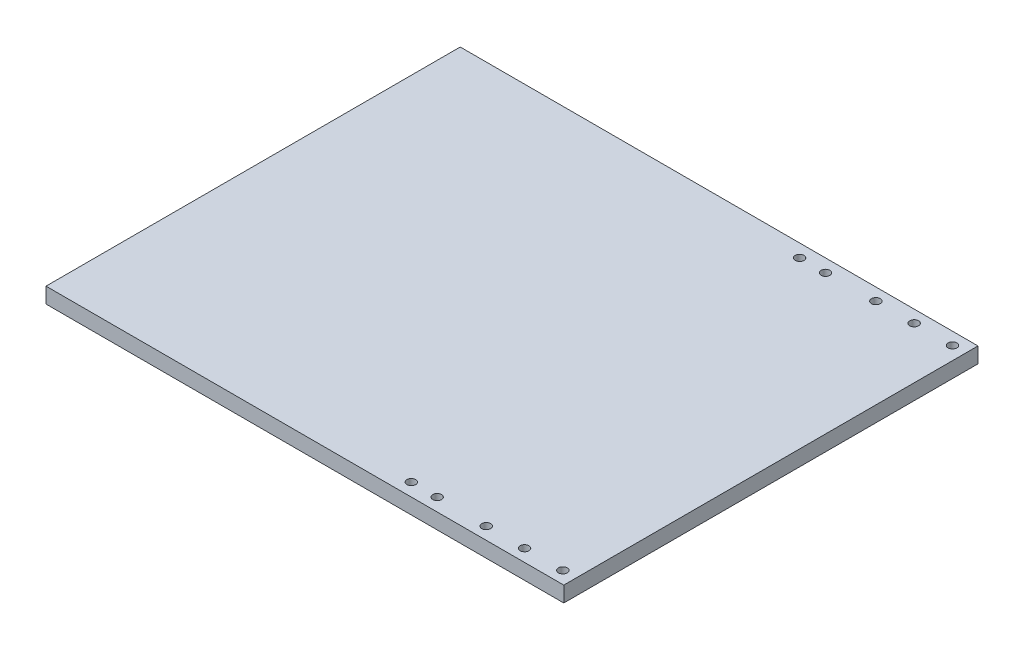
ISO-10303-21;
HEADER;
FILE_DESCRIPTION(('STEP AP214'),'2;1');
FILE_NAME('part.step','',(''),(''),'','','');
FILE_SCHEMA(('AUTOMOTIVE_DESIGN { 1 0 10303 214 1 1 1 1 }'));
ENDSEC;
DATA;
#1=APPLICATION_CONTEXT('core data for automotive mechanical design processes');
#2=APPLICATION_PROTOCOL_DEFINITION('international standard','automotive_design',2000,#1);
#3=PRODUCT_CONTEXT('',#1,'mechanical');
#4=PRODUCT('Part','Part','',(#3));
#5=PRODUCT_RELATED_PRODUCT_CATEGORY('part','',(#4));
#6=PRODUCT_DEFINITION_FORMATION('','',#4);
#7=PRODUCT_DEFINITION_CONTEXT('part definition',#1,'design');
#8=PRODUCT_DEFINITION('design','',#6,#7);
#9=PRODUCT_DEFINITION_SHAPE('','',#8);
#10=(LENGTH_UNIT() NAMED_UNIT(*) SI_UNIT(.MILLI.,.METRE.));
#11=(NAMED_UNIT(*) PLANE_ANGLE_UNIT() SI_UNIT($,.RADIAN.));
#12=(NAMED_UNIT(*) SI_UNIT($,.STERADIAN.) SOLID_ANGLE_UNIT());
#13=UNCERTAINTY_MEASURE_WITH_UNIT(LENGTH_MEASURE(1.E-05),#10,'distance_accuracy_value','');
#14=(GEOMETRIC_REPRESENTATION_CONTEXT(3) GLOBAL_UNCERTAINTY_ASSIGNED_CONTEXT((#13)) GLOBAL_UNIT_ASSIGNED_CONTEXT((#10,
#11,#12)) REPRESENTATION_CONTEXT('',''));
#15=CARTESIAN_POINT('',(0.,0.,0.));
#16=DIRECTION('',(0.,0.,1.));
#17=DIRECTION('',(1.,0.,0.));
#18=AXIS2_PLACEMENT_3D('',#15,#16,#17);
#19=CARTESIAN_POINT('',(100.,6.,80.));
#20=DIRECTION('',(-1.,0.,0.));
#21=DIRECTION('',(0.,0.,1.));
#22=AXIS2_PLACEMENT_3D('',#19,#20,#21);
#23=PLANE('',#22);
#24=DIRECTION('',(0.,0.,-1.));
#25=VECTOR('',#24,1.);
#26=CARTESIAN_POINT('',(100.,0.,80.));
#27=LINE('',#26,#25);
#28=CARTESIAN_POINT('',(100.,0.,80.));
#29=VERTEX_POINT('',#28);
#30=CARTESIAN_POINT('',(100.,0.,-80.));
#31=VERTEX_POINT('',#30);
#32=EDGE_CURVE('E96',#29,#31,#27,.T.);
#33=ORIENTED_EDGE('',*,*,#32,.T.);
#34=DIRECTION('',(0.,-1.,0.));
#35=VECTOR('',#34,1.);
#36=CARTESIAN_POINT('',(100.,6.,-80.));
#37=LINE('',#36,#35);
#38=CARTESIAN_POINT('',(100.,6.,-80.));
#39=VERTEX_POINT('',#38);
#40=EDGE_CURVE('E11',#39,#31,#37,.T.);
#41=ORIENTED_EDGE('',*,*,#40,.F.);
#42=DIRECTION('',(0.,0.,-1.));
#43=VECTOR('',#42,1.);
#44=CARTESIAN_POINT('',(100.,6.,80.));
#45=LINE('',#44,#43);
#46=CARTESIAN_POINT('',(100.,6.,80.));
#47=VERTEX_POINT('',#46);
#48=EDGE_CURVE('E84',#47,#39,#45,.T.);
#49=ORIENTED_EDGE('',*,*,#48,.F.);
#50=DIRECTION('',(0.,-1.,0.));
#51=VECTOR('',#50,1.);
#52=CARTESIAN_POINT('',(100.,6.,80.));
#53=LINE('',#52,#51);
#54=EDGE_CURVE('E92',#47,#29,#53,.T.);
#55=ORIENTED_EDGE('',*,*,#54,.T.);
#56=EDGE_LOOP('',(#33,#41,#49,#55));
#57=FACE_BOUND('',#56,.T.);
#58=ADVANCED_FACE('F33',(#57),#23,.F.);
#59=CARTESIAN_POINT('',(-100.,6.,-80.));
#60=DIRECTION('',(0.,0.,1.));
#61=DIRECTION('',(1.,0.,0.));
#62=AXIS2_PLACEMENT_3D('',#59,#60,#61);
#63=PLANE('',#62);
#64=DIRECTION('',(-1.,0.,0.));
#65=VECTOR('',#64,1.);
#66=CARTESIAN_POINT('',(-100.,0.,-80.));
#67=LINE('',#66,#65);
#68=CARTESIAN_POINT('',(-100.,0.,-80.));
#69=VERTEX_POINT('',#68);
#70=EDGE_CURVE('E88',#31,#69,#67,.T.);
#71=ORIENTED_EDGE('',*,*,#70,.T.);
#72=DIRECTION('',(0.,-1.,0.));
#73=VECTOR('',#72,1.);
#74=CARTESIAN_POINT('',(-100.,6.,-80.));
#75=LINE('',#74,#73);
#76=CARTESIAN_POINT('',(-100.,6.,-80.));
#77=VERTEX_POINT('',#76);
#78=EDGE_CURVE('E41',#77,#69,#75,.T.);
#79=ORIENTED_EDGE('',*,*,#78,.F.);
#80=DIRECTION('',(-1.,0.,0.));
#81=VECTOR('',#80,1.);
#82=CARTESIAN_POINT('',(-100.,6.,-80.));
#83=LINE('',#82,#81);
#84=EDGE_CURVE('E79',#39,#77,#83,.T.);
#85=ORIENTED_EDGE('',*,*,#84,.F.);
#86=ORIENTED_EDGE('',*,*,#40,.T.);
#87=EDGE_LOOP('',(#71,#79,#85,#86));
#88=FACE_BOUND('',#87,.T.);
#89=ADVANCED_FACE('F87',(#88),#63,.F.);
#90=CARTESIAN_POINT('',(-100.,6.,80.));
#91=DIRECTION('',(1.,0.,0.));
#92=DIRECTION('',(0.,0.,-1.));
#93=AXIS2_PLACEMENT_3D('',#90,#91,#92);
#94=PLANE('',#93);
#95=DIRECTION('',(0.,0.,1.));
#96=VECTOR('',#95,1.);
#97=CARTESIAN_POINT('',(-100.,0.,80.));
#98=LINE('',#97,#96);
#99=CARTESIAN_POINT('',(-100.,0.,80.));
#100=VERTEX_POINT('',#99);
#101=EDGE_CURVE('E66',#69,#100,#98,.T.);
#102=ORIENTED_EDGE('',*,*,#101,.T.);
#103=DIRECTION('',(0.,-1.,0.));
#104=VECTOR('',#103,1.);
#105=CARTESIAN_POINT('',(-100.,6.,80.));
#106=LINE('',#105,#104);
#107=CARTESIAN_POINT('',(-100.,6.,80.));
#108=VERTEX_POINT('',#107);
#109=EDGE_CURVE('E89',#108,#100,#106,.T.);
#110=ORIENTED_EDGE('',*,*,#109,.F.);
#111=DIRECTION('',(0.,0.,1.));
#112=VECTOR('',#111,1.);
#113=CARTESIAN_POINT('',(-100.,6.,80.));
#114=LINE('',#113,#112);
#115=EDGE_CURVE('E82',#77,#108,#114,.T.);
#116=ORIENTED_EDGE('',*,*,#115,.F.);
#117=ORIENTED_EDGE('',*,*,#78,.T.);
#118=EDGE_LOOP('',(#102,#110,#116,#117));
#119=FACE_BOUND('',#118,.T.);
#120=ADVANCED_FACE('F90',(#119),#94,.F.);
#121=CARTESIAN_POINT('',(-100.,6.,80.));
#122=DIRECTION('',(0.,0.,-1.));
#123=DIRECTION('',(-1.,0.,0.));
#124=AXIS2_PLACEMENT_3D('',#121,#122,#123);
#125=PLANE('',#124);
#126=DIRECTION('',(1.,0.,0.));
#127=VECTOR('',#126,1.);
#128=CARTESIAN_POINT('',(-100.,0.,80.));
#129=LINE('',#128,#127);
#130=EDGE_CURVE('E72',#100,#29,#129,.T.);
#131=ORIENTED_EDGE('',*,*,#130,.T.);
#132=ORIENTED_EDGE('',*,*,#54,.F.);
#133=DIRECTION('',(1.,0.,0.));
#134=VECTOR('',#133,1.);
#135=CARTESIAN_POINT('',(-100.,6.,80.));
#136=LINE('',#135,#134);
#137=EDGE_CURVE('E49',#108,#47,#136,.T.);
#138=ORIENTED_EDGE('',*,*,#137,.F.);
#139=ORIENTED_EDGE('',*,*,#109,.T.);
#140=EDGE_LOOP('',(#131,#132,#138,#139));
#141=FACE_BOUND('',#140,.T.);
#142=ADVANCED_FACE('F104',(#141),#125,.F.);
#143=CARTESIAN_POINT('',(0.,6.,0.));
#144=DIRECTION('',(0.,-1.,0.));
#145=DIRECTION('',(0.,0.,-1.));
#146=AXIS2_PLACEMENT_3D('',#143,#144,#145);
#147=PLANE('',#146);
#148=CARTESIAN_POINT('',(94.9,6.,75.2499999999993));
#149=DIRECTION('',(0.,1.,0.));
#150=DIRECTION('',(0.,0.,1.));
#151=AXIS2_PLACEMENT_3D('',#148,#149,#150);
#152=CIRCLE('',#151,1.69999999999999);
#153=CARTESIAN_POINT('',(94.9,6.,76.9499999999993));
#154=VERTEX_POINT('',#153);
#155=EDGE_CURVE('E166',#154,#154,#152,.T.);
#156=ORIENTED_EDGE('',*,*,#155,.F.);
#157=EDGE_LOOP('',(#156));
#158=FACE_BOUND('',#157,.T.);
#159=CARTESIAN_POINT('',(80.1,6.,75.2499999999993));
#160=DIRECTION('',(0.,1.,0.));
#161=DIRECTION('',(0.,0.,1.));
#162=AXIS2_PLACEMENT_3D('',#159,#160,#161);
#163=CIRCLE('',#162,1.69999999999999);
#164=CARTESIAN_POINT('',(80.1,6.,76.9499999999993));
#165=VERTEX_POINT('',#164);
#166=EDGE_CURVE('E160',#165,#165,#163,.T.);
#167=ORIENTED_EDGE('',*,*,#166,.F.);
#168=EDGE_LOOP('',(#167));
#169=FACE_BOUND('',#168,.T.);
#170=CARTESIAN_POINT('',(65.3,6.,75.2499999999993));
#171=DIRECTION('',(0.,1.,0.));
#172=DIRECTION('',(0.,0.,1.));
#173=AXIS2_PLACEMENT_3D('',#170,#171,#172);
#174=CIRCLE('',#173,1.69999999999999);
#175=CARTESIAN_POINT('',(65.3,6.,76.9499999999993));
#176=VERTEX_POINT('',#175);
#177=EDGE_CURVE('E154',#176,#176,#174,.T.);
#178=ORIENTED_EDGE('',*,*,#177,.F.);
#179=EDGE_LOOP('',(#178));
#180=FACE_BOUND('',#179,.T.);
#181=CARTESIAN_POINT('',(94.9000000000004,6.,-75.25));
#182=DIRECTION('',(0.,1.,0.));
#183=DIRECTION('',(0.,0.,1.));
#184=AXIS2_PLACEMENT_3D('',#181,#182,#183);
#185=CIRCLE('',#184,1.69999999999999);
#186=CARTESIAN_POINT('',(94.9000000000004,6.,-73.55));
#187=VERTEX_POINT('',#186);
#188=EDGE_CURVE('E148',#187,#187,#185,.T.);
#189=ORIENTED_EDGE('',*,*,#188,.F.);
#190=EDGE_LOOP('',(#189));
#191=FACE_BOUND('',#190,.T.);
#192=CARTESIAN_POINT('',(80.1000000000004,6.,-75.25));
#193=DIRECTION('',(0.,1.,0.));
#194=DIRECTION('',(0.,0.,1.));
#195=AXIS2_PLACEMENT_3D('',#192,#193,#194);
#196=CIRCLE('',#195,1.69999999999999);
#197=CARTESIAN_POINT('',(80.1000000000004,6.,-73.55));
#198=VERTEX_POINT('',#197);
#199=EDGE_CURVE('E142',#198,#198,#196,.T.);
#200=ORIENTED_EDGE('',*,*,#199,.F.);
#201=EDGE_LOOP('',(#200));
#202=FACE_BOUND('',#201,.T.);
#203=CARTESIAN_POINT('',(65.3000000000004,6.,-75.25));
#204=DIRECTION('',(0.,1.,0.));
#205=DIRECTION('',(0.,0.,1.));
#206=AXIS2_PLACEMENT_3D('',#203,#204,#205);
#207=CIRCLE('',#206,1.69999999999999);
#208=CARTESIAN_POINT('',(65.3000000000004,6.,-73.55));
#209=VERTEX_POINT('',#208);
#210=EDGE_CURVE('E136',#209,#209,#207,.T.);
#211=ORIENTED_EDGE('',*,*,#210,.F.);
#212=EDGE_LOOP('',(#211));
#213=FACE_BOUND('',#212,.T.);
#214=CARTESIAN_POINT('',(36.0999999999192,6.,75.0000000000013));
#215=DIRECTION('',(0.,1.,0.));
#216=DIRECTION('',(0.,0.,1.));
#217=AXIS2_PLACEMENT_3D('',#214,#215,#216);
#218=CIRCLE('',#217,1.7);
#219=CARTESIAN_POINT('',(36.0999999999192,6.,76.7000000000013));
#220=VERTEX_POINT('',#219);
#221=EDGE_CURVE('E130',#220,#220,#218,.T.);
#222=ORIENTED_EDGE('',*,*,#221,.F.);
#223=EDGE_LOOP('',(#222));
#224=FACE_BOUND('',#223,.T.);
#225=CARTESIAN_POINT('',(46.0999999999192,6.,75.0000000000013));
#226=DIRECTION('',(0.,1.,0.));
#227=DIRECTION('',(0.,0.,1.));
#228=AXIS2_PLACEMENT_3D('',#225,#226,#227);
#229=CIRCLE('',#228,1.7);
#230=CARTESIAN_POINT('',(46.0999999999192,6.,76.7000000000013));
#231=VERTEX_POINT('',#230);
#232=EDGE_CURVE('E124',#231,#231,#229,.T.);
#233=ORIENTED_EDGE('',*,*,#232,.F.);
#234=EDGE_LOOP('',(#233));
#235=FACE_BOUND('',#234,.T.);
#236=CARTESIAN_POINT('',(36.0999999999192,6.,-75.0000000000013));
#237=DIRECTION('',(0.,1.,0.));
#238=DIRECTION('',(0.,0.,1.));
#239=AXIS2_PLACEMENT_3D('',#236,#237,#238);
#240=CIRCLE('',#239,1.7);
#241=CARTESIAN_POINT('',(36.0999999999192,6.,-73.3000000000013));
#242=VERTEX_POINT('',#241);
#243=EDGE_CURVE('E118',#242,#242,#240,.T.);
#244=ORIENTED_EDGE('',*,*,#243,.F.);
#245=EDGE_LOOP('',(#244));
#246=FACE_BOUND('',#245,.T.);
#247=CARTESIAN_POINT('',(46.0999999999192,6.,-75.0000000000013));
#248=DIRECTION('',(0.,1.,0.));
#249=DIRECTION('',(0.,0.,1.));
#250=AXIS2_PLACEMENT_3D('',#247,#248,#249);
#251=CIRCLE('',#250,1.7);
#252=CARTESIAN_POINT('',(46.0999999999192,6.,-73.3000000000013));
#253=VERTEX_POINT('',#252);
#254=EDGE_CURVE('E112',#253,#253,#251,.T.);
#255=ORIENTED_EDGE('',*,*,#254,.F.);
#256=EDGE_LOOP('',(#255));
#257=FACE_BOUND('',#256,.T.);
#258=ORIENTED_EDGE('',*,*,#48,.T.);
#259=ORIENTED_EDGE('',*,*,#84,.T.);
#260=ORIENTED_EDGE('',*,*,#115,.T.);
#261=ORIENTED_EDGE('',*,*,#137,.T.);
#262=EDGE_LOOP('',(#258,#259,#260,#261));
#263=FACE_BOUND('',#262,.T.);
#264=ADVANCED_FACE('F80',(#158,#169,#180,#191,#202,#213,#224,#235,#246,#257,#263),#147,.F.);
#265=CARTESIAN_POINT('',(0.,0.,0.));
#266=DIRECTION('',(0.,-1.,0.));
#267=DIRECTION('',(0.,0.,-1.));
#268=AXIS2_PLACEMENT_3D('',#265,#266,#267);
#269=PLANE('',#268);
#270=CARTESIAN_POINT('',(94.9,0.,75.2499999999993));
#271=DIRECTION('',(0.,1.,0.));
#272=DIRECTION('',(0.,0.,1.));
#273=AXIS2_PLACEMENT_3D('',#270,#271,#272);
#274=CIRCLE('',#273,1.69999999999999);
#275=CARTESIAN_POINT('',(94.9,0.,76.9499999999993));
#276=VERTEX_POINT('',#275);
#277=EDGE_CURVE('E163',#276,#276,#274,.T.);
#278=ORIENTED_EDGE('',*,*,#277,.T.);
#279=EDGE_LOOP('',(#278));
#280=FACE_BOUND('',#279,.T.);
#281=CARTESIAN_POINT('',(80.1,0.,75.2499999999993));
#282=DIRECTION('',(0.,1.,0.));
#283=DIRECTION('',(0.,0.,1.));
#284=AXIS2_PLACEMENT_3D('',#281,#282,#283);
#285=CIRCLE('',#284,1.69999999999999);
#286=CARTESIAN_POINT('',(80.1,0.,76.9499999999993));
#287=VERTEX_POINT('',#286);
#288=EDGE_CURVE('E157',#287,#287,#285,.T.);
#289=ORIENTED_EDGE('',*,*,#288,.T.);
#290=EDGE_LOOP('',(#289));
#291=FACE_BOUND('',#290,.T.);
#292=CARTESIAN_POINT('',(65.3,0.,75.2499999999993));
#293=DIRECTION('',(0.,1.,0.));
#294=DIRECTION('',(0.,0.,1.));
#295=AXIS2_PLACEMENT_3D('',#292,#293,#294);
#296=CIRCLE('',#295,1.69999999999999);
#297=CARTESIAN_POINT('',(65.3,0.,76.9499999999993));
#298=VERTEX_POINT('',#297);
#299=EDGE_CURVE('E151',#298,#298,#296,.T.);
#300=ORIENTED_EDGE('',*,*,#299,.T.);
#301=EDGE_LOOP('',(#300));
#302=FACE_BOUND('',#301,.T.);
#303=CARTESIAN_POINT('',(94.9000000000004,0.,-75.25));
#304=DIRECTION('',(0.,1.,0.));
#305=DIRECTION('',(0.,0.,1.));
#306=AXIS2_PLACEMENT_3D('',#303,#304,#305);
#307=CIRCLE('',#306,1.69999999999999);
#308=CARTESIAN_POINT('',(94.9000000000004,0.,-73.55));
#309=VERTEX_POINT('',#308);
#310=EDGE_CURVE('E145',#309,#309,#307,.T.);
#311=ORIENTED_EDGE('',*,*,#310,.T.);
#312=EDGE_LOOP('',(#311));
#313=FACE_BOUND('',#312,.T.);
#314=CARTESIAN_POINT('',(80.1000000000004,0.,-75.25));
#315=DIRECTION('',(0.,1.,0.));
#316=DIRECTION('',(0.,0.,1.));
#317=AXIS2_PLACEMENT_3D('',#314,#315,#316);
#318=CIRCLE('',#317,1.69999999999999);
#319=CARTESIAN_POINT('',(80.1000000000004,0.,-73.55));
#320=VERTEX_POINT('',#319);
#321=EDGE_CURVE('E139',#320,#320,#318,.T.);
#322=ORIENTED_EDGE('',*,*,#321,.T.);
#323=EDGE_LOOP('',(#322));
#324=FACE_BOUND('',#323,.T.);
#325=CARTESIAN_POINT('',(65.3000000000004,0.,-75.25));
#326=DIRECTION('',(0.,1.,0.));
#327=DIRECTION('',(0.,0.,1.));
#328=AXIS2_PLACEMENT_3D('',#325,#326,#327);
#329=CIRCLE('',#328,1.69999999999999);
#330=CARTESIAN_POINT('',(65.3000000000004,0.,-73.55));
#331=VERTEX_POINT('',#330);
#332=EDGE_CURVE('E133',#331,#331,#329,.T.);
#333=ORIENTED_EDGE('',*,*,#332,.T.);
#334=EDGE_LOOP('',(#333));
#335=FACE_BOUND('',#334,.T.);
#336=CARTESIAN_POINT('',(36.0999999999192,0.,75.0000000000013));
#337=DIRECTION('',(0.,1.,0.));
#338=DIRECTION('',(0.,0.,1.));
#339=AXIS2_PLACEMENT_3D('',#336,#337,#338);
#340=CIRCLE('',#339,1.7);
#341=CARTESIAN_POINT('',(36.0999999999192,0.,76.7000000000013));
#342=VERTEX_POINT('',#341);
#343=EDGE_CURVE('E127',#342,#342,#340,.T.);
#344=ORIENTED_EDGE('',*,*,#343,.T.);
#345=EDGE_LOOP('',(#344));
#346=FACE_BOUND('',#345,.T.);
#347=CARTESIAN_POINT('',(46.0999999999192,0.,75.0000000000013));
#348=DIRECTION('',(0.,1.,0.));
#349=DIRECTION('',(0.,0.,1.));
#350=AXIS2_PLACEMENT_3D('',#347,#348,#349);
#351=CIRCLE('',#350,1.7);
#352=CARTESIAN_POINT('',(46.0999999999192,0.,76.7000000000013));
#353=VERTEX_POINT('',#352);
#354=EDGE_CURVE('E121',#353,#353,#351,.T.);
#355=ORIENTED_EDGE('',*,*,#354,.T.);
#356=EDGE_LOOP('',(#355));
#357=FACE_BOUND('',#356,.T.);
#358=CARTESIAN_POINT('',(36.0999999999192,0.,-75.0000000000013));
#359=DIRECTION('',(0.,1.,0.));
#360=DIRECTION('',(0.,0.,1.));
#361=AXIS2_PLACEMENT_3D('',#358,#359,#360);
#362=CIRCLE('',#361,1.7);
#363=CARTESIAN_POINT('',(36.0999999999192,0.,-73.3000000000013));
#364=VERTEX_POINT('',#363);
#365=EDGE_CURVE('E115',#364,#364,#362,.T.);
#366=ORIENTED_EDGE('',*,*,#365,.T.);
#367=EDGE_LOOP('',(#366));
#368=FACE_BOUND('',#367,.T.);
#369=CARTESIAN_POINT('',(46.0999999999192,0.,-75.0000000000013));
#370=DIRECTION('',(0.,1.,0.));
#371=DIRECTION('',(0.,0.,1.));
#372=AXIS2_PLACEMENT_3D('',#369,#370,#371);
#373=CIRCLE('',#372,1.7);
#374=CARTESIAN_POINT('',(46.0999999999192,0.,-73.3000000000013));
#375=VERTEX_POINT('',#374);
#376=EDGE_CURVE('E99',#375,#375,#373,.T.);
#377=ORIENTED_EDGE('',*,*,#376,.T.);
#378=EDGE_LOOP('',(#377));
#379=FACE_BOUND('',#378,.T.);
#380=ORIENTED_EDGE('',*,*,#32,.F.);
#381=ORIENTED_EDGE('',*,*,#130,.F.);
#382=ORIENTED_EDGE('',*,*,#101,.F.);
#383=ORIENTED_EDGE('',*,*,#70,.F.);
#384=EDGE_LOOP('',(#380,#381,#382,#383));
#385=FACE_BOUND('',#384,.T.);
#386=ADVANCED_FACE('F107',(#280,#291,#302,#313,#324,#335,#346,#357,#368,#379,#385),#269,.T.);
#387=CARTESIAN_POINT('',(46.0999999999192,6.,-75.0000000000013));
#388=DIRECTION('',(0.,1.,0.));
#389=DIRECTION('',(0.,0.,1.));
#390=AXIS2_PLACEMENT_3D('',#387,#388,#389);
#391=CYLINDRICAL_SURFACE('',#390,1.7);
#392=ORIENTED_EDGE('',*,*,#376,.F.);
#393=EDGE_LOOP('',(#392));
#394=FACE_BOUND('',#393,.T.);
#395=ORIENTED_EDGE('',*,*,#254,.T.);
#396=EDGE_LOOP('',(#395));
#397=FACE_BOUND('',#396,.T.);
#398=ADVANCED_FACE('F193',(#394,#397),#391,.F.);
#399=CARTESIAN_POINT('',(36.0999999999192,6.,-75.0000000000013));
#400=DIRECTION('',(0.,1.,0.));
#401=DIRECTION('',(0.,0.,1.));
#402=AXIS2_PLACEMENT_3D('',#399,#400,#401);
#403=CYLINDRICAL_SURFACE('',#402,1.7);
#404=ORIENTED_EDGE('',*,*,#365,.F.);
#405=EDGE_LOOP('',(#404));
#406=FACE_BOUND('',#405,.T.);
#407=ORIENTED_EDGE('',*,*,#243,.T.);
#408=EDGE_LOOP('',(#407));
#409=FACE_BOUND('',#408,.T.);
#410=ADVANCED_FACE('F195',(#406,#409),#403,.F.);
#411=CARTESIAN_POINT('',(46.0999999999192,6.,75.0000000000013));
#412=DIRECTION('',(0.,1.,0.));
#413=DIRECTION('',(0.,0.,1.));
#414=AXIS2_PLACEMENT_3D('',#411,#412,#413);
#415=CYLINDRICAL_SURFACE('',#414,1.7);
#416=ORIENTED_EDGE('',*,*,#354,.F.);
#417=EDGE_LOOP('',(#416));
#418=FACE_BOUND('',#417,.T.);
#419=ORIENTED_EDGE('',*,*,#232,.T.);
#420=EDGE_LOOP('',(#419));
#421=FACE_BOUND('',#420,.T.);
#422=ADVANCED_FACE('F202',(#418,#421),#415,.F.);
#423=CARTESIAN_POINT('',(36.0999999999192,6.,75.0000000000013));
#424=DIRECTION('',(0.,1.,0.));
#425=DIRECTION('',(0.,0.,1.));
#426=AXIS2_PLACEMENT_3D('',#423,#424,#425);
#427=CYLINDRICAL_SURFACE('',#426,1.7);
#428=ORIENTED_EDGE('',*,*,#343,.F.);
#429=EDGE_LOOP('',(#428));
#430=FACE_BOUND('',#429,.T.);
#431=ORIENTED_EDGE('',*,*,#221,.T.);
#432=EDGE_LOOP('',(#431));
#433=FACE_BOUND('',#432,.T.);
#434=ADVANCED_FACE('F245',(#430,#433),#427,.F.);
#435=CARTESIAN_POINT('',(65.3000000000004,6.,-75.25));
#436=DIRECTION('',(0.,1.,0.));
#437=DIRECTION('',(0.,0.,1.));
#438=AXIS2_PLACEMENT_3D('',#435,#436,#437);
#439=CYLINDRICAL_SURFACE('',#438,1.69999999999999);
#440=ORIENTED_EDGE('',*,*,#332,.F.);
#441=EDGE_LOOP('',(#440));
#442=FACE_BOUND('',#441,.T.);
#443=ORIENTED_EDGE('',*,*,#210,.T.);
#444=EDGE_LOOP('',(#443));
#445=FACE_BOUND('',#444,.T.);
#446=ADVANCED_FACE('F239',(#442,#445),#439,.F.);
#447=CARTESIAN_POINT('',(80.1000000000004,6.,-75.25));
#448=DIRECTION('',(0.,1.,0.));
#449=DIRECTION('',(0.,0.,1.));
#450=AXIS2_PLACEMENT_3D('',#447,#448,#449);
#451=CYLINDRICAL_SURFACE('',#450,1.69999999999999);
#452=ORIENTED_EDGE('',*,*,#321,.F.);
#453=EDGE_LOOP('',(#452));
#454=FACE_BOUND('',#453,.T.);
#455=ORIENTED_EDGE('',*,*,#199,.T.);
#456=EDGE_LOOP('',(#455));
#457=FACE_BOUND('',#456,.T.);
#458=ADVANCED_FACE('F244',(#454,#457),#451,.F.);
#459=CARTESIAN_POINT('',(94.9000000000004,6.,-75.25));
#460=DIRECTION('',(0.,1.,0.));
#461=DIRECTION('',(0.,0.,1.));
#462=AXIS2_PLACEMENT_3D('',#459,#460,#461);
#463=CYLINDRICAL_SURFACE('',#462,1.69999999999999);
#464=ORIENTED_EDGE('',*,*,#310,.F.);
#465=EDGE_LOOP('',(#464));
#466=FACE_BOUND('',#465,.T.);
#467=ORIENTED_EDGE('',*,*,#188,.T.);
#468=EDGE_LOOP('',(#467));
#469=FACE_BOUND('',#468,.T.);
#470=ADVANCED_FACE('F257',(#466,#469),#463,.F.);
#471=CARTESIAN_POINT('',(65.3,6.,75.2499999999993));
#472=DIRECTION('',(0.,1.,0.));
#473=DIRECTION('',(0.,0.,1.));
#474=AXIS2_PLACEMENT_3D('',#471,#472,#473);
#475=CYLINDRICAL_SURFACE('',#474,1.69999999999999);
#476=ORIENTED_EDGE('',*,*,#299,.F.);
#477=EDGE_LOOP('',(#476));
#478=FACE_BOUND('',#477,.T.);
#479=ORIENTED_EDGE('',*,*,#177,.T.);
#480=EDGE_LOOP('',(#479));
#481=FACE_BOUND('',#480,.T.);
#482=ADVANCED_FACE('F267',(#478,#481),#475,.F.);
#483=CARTESIAN_POINT('',(80.1,6.,75.2499999999993));
#484=DIRECTION('',(0.,1.,0.));
#485=DIRECTION('',(0.,0.,1.));
#486=AXIS2_PLACEMENT_3D('',#483,#484,#485);
#487=CYLINDRICAL_SURFACE('',#486,1.69999999999999);
#488=ORIENTED_EDGE('',*,*,#288,.F.);
#489=EDGE_LOOP('',(#488));
#490=FACE_BOUND('',#489,.T.);
#491=ORIENTED_EDGE('',*,*,#166,.T.);
#492=EDGE_LOOP('',(#491));
#493=FACE_BOUND('',#492,.T.);
#494=ADVANCED_FACE('F277',(#490,#493),#487,.F.);
#495=CARTESIAN_POINT('',(94.9,6.,75.2499999999993));
#496=DIRECTION('',(0.,1.,0.));
#497=DIRECTION('',(0.,0.,1.));
#498=AXIS2_PLACEMENT_3D('',#495,#496,#497);
#499=CYLINDRICAL_SURFACE('',#498,1.69999999999999);
#500=ORIENTED_EDGE('',*,*,#277,.F.);
#501=EDGE_LOOP('',(#500));
#502=FACE_BOUND('',#501,.T.);
#503=ORIENTED_EDGE('',*,*,#155,.T.);
#504=EDGE_LOOP('',(#503));
#505=FACE_BOUND('',#504,.T.);
#506=ADVANCED_FACE('F170',(#502,#505),#499,.F.);
#507=CLOSED_SHELL('',(#58,#89,#120,#142,#264,#386,#398,#410,#422,#434,#446,#458,#470,#482,#494,#506));
#508=MANIFOLD_SOLID_BREP('B2',#507);
#509=ADVANCED_BREP_SHAPE_REPRESENTATION('',(#18,#508),#14);
#510=SHAPE_DEFINITION_REPRESENTATION(#9,#509);
ENDSEC;
END-ISO-10303-21;
